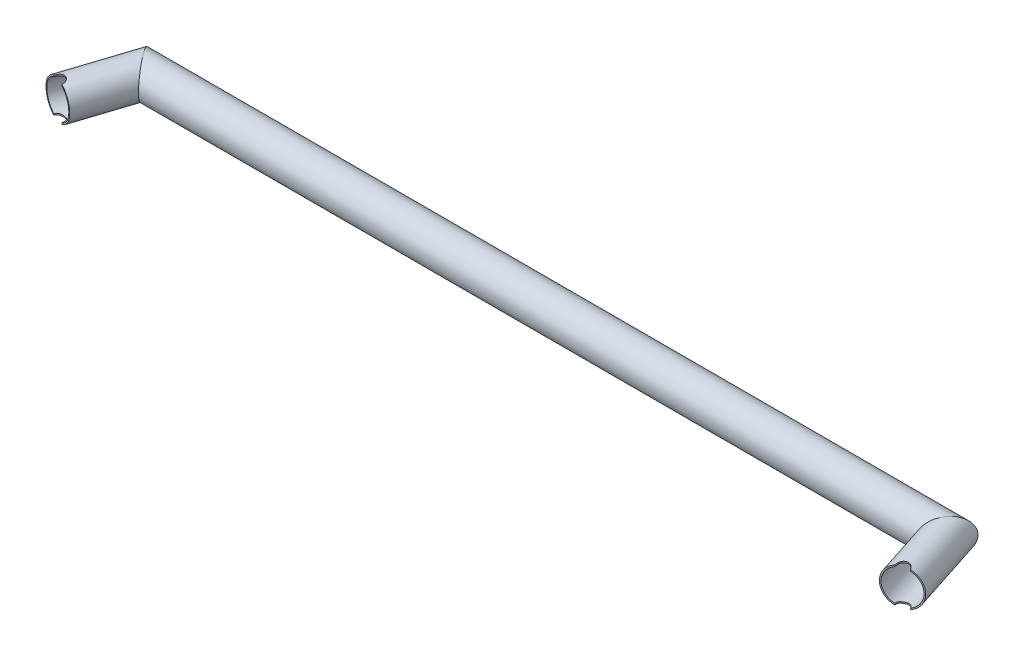
ISO-10303-21;
HEADER;
FILE_DESCRIPTION(('STEP AP214'),'2;1');
FILE_NAME('part.step','',(''),(''),'','','');
FILE_SCHEMA(('AUTOMOTIVE_DESIGN { 1 0 10303 214 1 1 1 1 }'));
ENDSEC;
DATA;
#1=APPLICATION_CONTEXT('core data for automotive mechanical design processes');
#2=APPLICATION_PROTOCOL_DEFINITION('international standard','automotive_design',2000,#1);
#3=PRODUCT_CONTEXT('',#1,'mechanical');
#4=PRODUCT('Part','Part','',(#3));
#5=PRODUCT_RELATED_PRODUCT_CATEGORY('part','',(#4));
#6=PRODUCT_DEFINITION_FORMATION('','',#4);
#7=PRODUCT_DEFINITION_CONTEXT('part definition',#1,'design');
#8=PRODUCT_DEFINITION('design','',#6,#7);
#9=PRODUCT_DEFINITION_SHAPE('','',#8);
#10=(LENGTH_UNIT() NAMED_UNIT(*) SI_UNIT(.MILLI.,.METRE.));
#11=(NAMED_UNIT(*) PLANE_ANGLE_UNIT() SI_UNIT($,.RADIAN.));
#12=(NAMED_UNIT(*) SI_UNIT($,.STERADIAN.) SOLID_ANGLE_UNIT());
#13=UNCERTAINTY_MEASURE_WITH_UNIT(LENGTH_MEASURE(1.E-05),#10,'distance_accuracy_value','');
#14=(GEOMETRIC_REPRESENTATION_CONTEXT(3) GLOBAL_UNCERTAINTY_ASSIGNED_CONTEXT((#13)) GLOBAL_UNIT_ASSIGNED_CONTEXT((#10,
#11,#12)) REPRESENTATION_CONTEXT('',''));
#15=CARTESIAN_POINT('',(0.,0.,0.));
#16=DIRECTION('',(0.,0.,1.));
#17=DIRECTION('',(1.,0.,0.));
#18=AXIS2_PLACEMENT_3D('',#15,#16,#17);
#19=CARTESIAN_POINT('',(-240.81,0.,36.88));
#20=DIRECTION('',(-0.309016994374952,0.,0.951056516295152));
#21=DIRECTION('',(0.951056516295152,0.,0.309016994374952));
#22=AXIS2_PLACEMENT_3D('',#19,#20,#21);
#23=PLANE('',#22);
#24=DIRECTION('',(0.,1.,0.));
#25=VECTOR('',#24,1.);
#26=CARTESIAN_POINT('',(-237.481302192967,-10.5,37.9615594803124));
#27=LINE('',#26,#25);
#28=CARTESIAN_POINT('',(-237.481302192967,-9.89949493661157,37.9615594803124));
#29=VERTEX_POINT('',#28);
#30=CARTESIAN_POINT('',(-237.481302192967,-9.10013736160055,37.9615594803124));
#31=VERTEX_POINT('',#30);
#32=EDGE_CURVE('E68',#29,#31,#27,.T.);
#33=ORIENTED_EDGE('',*,*,#32,.F.);
#34=CARTESIAN_POINT('',(-240.81,0.,36.88));
#35=DIRECTION('',(-0.309016994374952,0.,0.951056516295152));
#36=DIRECTION('',(0.951056516295152,0.,0.309016994374952));
#37=AXIS2_PLACEMENT_3D('',#34,#35,#36);
#38=CIRCLE('',#37,10.5);
#39=CARTESIAN_POINT('',(-237.481302192967,9.89949493661157,37.9615594803124));
#40=VERTEX_POINT('',#39);
#41=EDGE_CURVE('E157',#29,#40,#38,.T.);
#42=ORIENTED_EDGE('',*,*,#41,.T.);
#43=CARTESIAN_POINT('',(-237.481302192967,9.10013736160055,37.9615594803124));
#44=VERTEX_POINT('',#43);
#45=EDGE_CURVE('E239',#44,#40,#27,.T.);
#46=ORIENTED_EDGE('',*,*,#45,.F.);
#47=CARTESIAN_POINT('',(-240.81,0.,36.88));
#48=DIRECTION('',(-0.309016994374952,0.,0.951056516295152));
#49=DIRECTION('',(0.951056516295152,0.,0.309016994374952));
#50=AXIS2_PLACEMENT_3D('',#47,#48,#49);
#51=CIRCLE('',#50,9.75);
#52=EDGE_CURVE('E153',#44,#31,#51,.F.);
#53=ORIENTED_EDGE('',*,*,#52,.T.);
#54=EDGE_LOOP('',(#33,#42,#46,#53));
#55=FACE_BOUND('',#54,.T.);
#56=ADVANCED_FACE('F39',(#55),#23,.T.);
#57=CARTESIAN_POINT('',(240.81,0.,36.8799999999999));
#58=DIRECTION('',(-0.309016994374945,0.,-0.951056516295154));
#59=DIRECTION('',(-0.951056516295154,0.,0.309016994374945));
#60=AXIS2_PLACEMENT_3D('',#57,#58,#59);
#61=PLANE('',#60);
#62=CARTESIAN_POINT('',(240.81,0.,36.8799999999999));
#63=DIRECTION('',(-0.309016994374945,0.,-0.951056516295154));
#64=DIRECTION('',(-0.951056516295154,0.,0.309016994374945));
#65=AXIS2_PLACEMENT_3D('',#62,#63,#64);
#66=CIRCLE('',#65,10.5);
#67=CARTESIAN_POINT('',(237.481302192967,-9.89949493661166,37.9615594803122));
#68=VERTEX_POINT('',#67);
#69=CARTESIAN_POINT('',(237.481302192967,9.89949493661166,37.9615594803122));
#70=VERTEX_POINT('',#69);
#71=EDGE_CURVE('E128',#68,#70,#66,.T.);
#72=ORIENTED_EDGE('',*,*,#71,.F.);
#73=DIRECTION('',(0.,1.,0.));
#74=VECTOR('',#73,1.);
#75=CARTESIAN_POINT('',(237.481302192967,-10.5,37.9615594803122));
#76=LINE('',#75,#74);
#77=CARTESIAN_POINT('',(237.481302192967,-9.10013736160064,37.9615594803122));
#78=VERTEX_POINT('',#77);
#79=EDGE_CURVE('E115',#68,#78,#76,.T.);
#80=ORIENTED_EDGE('',*,*,#79,.T.);
#81=CARTESIAN_POINT('',(240.81,0.,36.8799999999999));
#82=DIRECTION('',(-0.309016994374945,0.,-0.951056516295154));
#83=DIRECTION('',(-0.951056516295154,0.,0.309016994374945));
#84=AXIS2_PLACEMENT_3D('',#81,#82,#83);
#85=CIRCLE('',#84,9.75);
#86=CARTESIAN_POINT('',(237.481302192967,9.10013736160064,37.9615594803122));
#87=VERTEX_POINT('',#86);
#88=EDGE_CURVE('E126',#87,#78,#85,.F.);
#89=ORIENTED_EDGE('',*,*,#88,.F.);
#90=EDGE_CURVE('E134',#87,#70,#76,.T.);
#91=ORIENTED_EDGE('',*,*,#90,.T.);
#92=EDGE_LOOP('',(#72,#80,#89,#91));
#93=FACE_BOUND('',#92,.T.);
#94=ADVANCED_FACE('F127',(#93),#61,.F.);
#95=CARTESIAN_POINT('',(-226.202923338746,0.,-8.0759593665988));
#96=DIRECTION('',(-0.309016994374952,0.,0.951056516295152));
#97=DIRECTION('',(0.951056516295152,0.,0.309016994374952));
#98=AXIS2_PLACEMENT_3D('',#95,#96,#97);
#99=CYLINDRICAL_SURFACE('',#98,10.5);
#100=CARTESIAN_POINT('',(-244.138697807033,-9.89949493661176,35.7984405196877));
#101=CARTESIAN_POINT('',(-244.109201773844,-9.89947970582429,35.7076203297763));
#102=CARTESIAN_POINT('',(-244.075968100117,-9.90087621466406,35.6180235243606));
#103=CARTESIAN_POINT('',(-244.002342342284,-9.90637933769418,35.4419345791928));
#104=CARTESIAN_POINT('',(-243.961952192697,-9.91048522030907,35.3554416079999));
#105=CARTESIAN_POINT('',(-243.874443481843,-9.92127787353517,35.1864184196311));
#106=CARTESIAN_POINT('',(-243.827345139319,-9.92795698790174,35.1038772559007));
#107=CARTESIAN_POINT('',(-243.726728962994,-9.94367667868409,34.9430694790435));
#108=CARTESIAN_POINT('',(-243.673210897225,-9.95271734044466,34.8648030205253));
#109=CARTESIAN_POINT('',(-243.503685586592,-9.9829791711149,34.6372932850828));
#110=CARTESIAN_POINT('',(-243.378577035287,-10.0073574143772,34.4950893907313));
#111=CARTESIAN_POINT('',(-243.107795488754,-10.0617584772249,34.2331695030338));
#112=CARTESIAN_POINT('',(-242.962109891135,-10.0917847597135,34.1134673963946));
#113=CARTESIAN_POINT('',(-242.648343267814,-10.1554065534544,33.8953305008831));
#114=CARTESIAN_POINT('',(-242.479653145938,-10.1890906519993,33.7977957918276));
#115=CARTESIAN_POINT('',(-242.128272815961,-10.2554847741582,33.6319357736357));
#116=CARTESIAN_POINT('',(-241.945580122971,-10.2881946234457,33.5636156631274));
#117=CARTESIAN_POINT('',(-241.565755077858,-10.349985885373,33.456734798584));
#118=CARTESIAN_POINT('',(-241.368370299057,-10.3789503095517,33.4189973290033));
#119=CARTESIAN_POINT('',(-240.969068577431,-10.4289363062747,33.3778653410457));
#120=CARTESIAN_POINT('',(-240.76715303886,-10.4499603047961,33.374460325155));
#121=CARTESIAN_POINT('',(-240.371924196473,-10.4810674890078,33.402076170313));
#122=CARTESIAN_POINT('',(-240.178555982993,-10.4915058154536,33.4319036345193));
#123=CARTESIAN_POINT('',(-239.799246168049,-10.5015262932802,33.5234519048833));
#124=CARTESIAN_POINT('',(-239.613302807571,-10.5011110314386,33.5851651081528));
#125=CARTESIAN_POINT('',(-239.261656688632,-10.4897113564684,33.7355174229137));
#126=CARTESIAN_POINT('',(-239.095446088705,-10.4791421505107,33.8230054337891));
#127=CARTESIAN_POINT('',(-238.7796955859,-10.4491436017114,34.0229404471008));
#128=CARTESIAN_POINT('',(-238.630156607969,-10.4297137675838,34.1353888333114));
#129=CARTESIAN_POINT('',(-238.349613855659,-10.3836484493089,34.3835925466223));
#130=CARTESIAN_POINT('',(-238.218879750987,-10.3569215489312,34.5196349813673));
#131=CARTESIAN_POINT('',(-237.981256084243,-10.2990433441501,34.8103455556596));
#132=CARTESIAN_POINT('',(-237.874373024352,-10.2678908370334,34.9650187566033));
#133=CARTESIAN_POINT('',(-237.682364755626,-10.2027203963027,35.296848827253));
#134=CARTESIAN_POINT('',(-237.598498161332,-10.168636603316,35.4747207290265));
#135=CARTESIAN_POINT('',(-237.461552064857,-10.1026588159504,35.8425228499273));
#136=CARTESIAN_POINT('',(-237.408482500791,-10.0707655313662,36.0324569395766));
#137=CARTESIAN_POINT('',(-237.353006447623,-10.0271289702318,36.3239274614811));
#138=CARTESIAN_POINT('',(-237.338520001939,-10.0131924325295,36.4229764705378));
#139=CARTESIAN_POINT('',(-237.318074667001,-9.98726461907497,36.6221905360224));
#140=CARTESIAN_POINT('',(-237.312112221979,-9.97527253405059,36.7223551095119));
#141=CARTESIAN_POINT('',(-237.308827237367,-9.95363891405562,36.9229646755387));
#142=CARTESIAN_POINT('',(-237.311495258866,-9.94399482355499,37.0234092417649));
#143=CARTESIAN_POINT('',(-237.325485882849,-9.92736924487806,37.2238767401061));
#144=CARTESIAN_POINT('',(-237.336804526677,-9.92038654100079,37.3238998440426));
#145=CARTESIAN_POINT('',(-237.366758733997,-9.90978565811347,37.5145124577984));
#146=CARTESIAN_POINT('',(-237.384710611301,-9.90593670954808,37.6051971355792));
#147=CARTESIAN_POINT('',(-237.427715738225,-9.90078628908031,37.7848154269106));
#148=CARTESIAN_POINT('',(-237.452759776557,-9.89948153000924,37.8737511528065));
#149=CARTESIAN_POINT('',(-237.481302192967,-9.89949493661157,37.9615594803124));
#150=B_SPLINE_CURVE_WITH_KNOTS('',3,(#100,#101,#102,#103,#104,#105,#106,#107,#108,#109,#110,
#111,#112,#113,#114,#115,#116,#117,#118,#119,#120,#121,#122,#123,#124,#125,#126,#127,#128,#129,
#130,#131,#132,#133,#134,#135,#136,#137,#138,#139,#140,#141,#142,#143,#144,#145,#146,#147,#148,
#149),.UNSPECIFIED.,.F.,.F.,(4,2,2,2,2,2,2,2,2,2,2,2,2,2,2,2,2,2,2,2,2,2,2,2,4),(0.,
0.286364696574011,0.572652101593118,0.858094201200715,1.14354661792755,1.71361423692558,
2.28403251951735,2.87459009723744,3.4652527187749,4.07133207620232,4.67722611278323,
5.26204389900287,5.84672230461621,6.40846706984446,6.97024298533242,7.53940808245256,
8.10872815415062,8.70480431557548,9.30107272226721,9.60395972919264,9.90672035058273,
10.2091499627614,10.5114412613721,10.7886947359792,11.0655897528501),.UNSPECIFIED.);
#151=CARTESIAN_POINT('',(-244.138697807033,-9.89949493661176,35.7984405196878));
#152=VERTEX_POINT('',#151);
#153=EDGE_CURVE('E238',#152,#29,#150,.T.);
#154=ORIENTED_EDGE('',*,*,#153,.F.);
#155=CARTESIAN_POINT('',(-244.138697807033,9.89949493661176,35.7984405196878));
#156=VERTEX_POINT('',#155);
#157=EDGE_CURVE('E158',#156,#152,#38,.T.);
#158=ORIENTED_EDGE('',*,*,#157,.F.);
#159=CARTESIAN_POINT('',(-237.481302192967,9.89949493661157,37.9615594803124));
#160=CARTESIAN_POINT('',(-237.451782216843,9.89947970582411,37.8707470699321));
#161=CARTESIAN_POINT('',(-237.426005142798,9.90087621466387,37.7787274684127));
#162=CARTESIAN_POINT('',(-237.382067147047,9.906379337694,37.5929923846075));
#163=CARTESIAN_POINT('',(-237.363904171574,9.91048522030889,37.4992773667536));
#164=CARTESIAN_POINT('',(-237.335350868393,9.92127787353499,37.3110984052322));
#165=CARTESIAN_POINT('',(-237.324937749153,9.92795698790156,37.2166374898963));
#166=CARTESIAN_POINT('',(-237.311817506018,9.94367667868391,37.0274005610051));
#167=CARTESIAN_POINT('',(-237.309110660665,9.95271734044448,36.9326245361842));
#168=CARTESIAN_POINT('',(-237.312532650698,9.98297917111473,36.6489208163449));
#169=CARTESIAN_POINT('',(-237.330162242927,10.007357414377,36.4603384877556));
#170=CARTESIAN_POINT('',(-237.395276468565,10.0617584772247,36.0892794477986));
#171=CARTESIAN_POINT('',(-237.442779459924,10.0917847597134,35.9068065635127));
#172=CARTESIAN_POINT('',(-237.568404340295,10.1554065534543,35.5459027140945));
#173=CARTESIAN_POINT('',(-237.647548052107,10.1890906519991,35.3678419110808));
#174=CARTESIAN_POINT('',(-237.834330637909,10.2554847741581,35.0271221617702));
#175=CARTESIAN_POINT('',(-237.941974577894,10.2881946234456,34.8644659606701));
#176=CARTESIAN_POINT('',(-238.186436498349,10.3499858853729,34.5547419649123));
#177=CARTESIAN_POINT('',(-238.323942610752,10.3789503095516,34.4081918486903));
#178=CARTESIAN_POINT('',(-238.622807713512,10.4289363062746,34.1402117082334));
#179=CARTESIAN_POINT('',(-238.784159397519,10.4499603047961,34.0187740167312));
#180=CARTESIAN_POINT('',(-239.120138434191,10.4810674890078,33.8088060199422));
#181=CARTESIAN_POINT('',(-239.294108748642,10.4915058154536,33.7192779612389));
#182=CARTESIAN_POINT('',(-239.654787558257,10.5015262932802,33.5703893524951));
#183=CARTESIAN_POINT('',(-239.841493007629,10.5011110314386,33.5110216176669));
#184=CARTESIAN_POINT('',(-240.214355567121,10.4897113564684,33.4259667927133));
#185=CARTESIAN_POINT('',(-240.400246929653,10.4791421505108,33.3990499409038));
#186=CARTESIAN_POINT('',(-240.773213304645,10.4491436017115,33.3752072754911));
#187=CARTESIAN_POINT('',(-240.960288382172,10.4297137675839,33.3782831250546));
#188=CARTESIAN_POINT('',(-241.333142718688,10.383648449309,33.4141852547449));
#189=CARTESIAN_POINT('',(-241.518872567941,10.3569215489313,33.4474023177118));
#190=CARTESIAN_POINT('',(-241.881989540857,10.2990433441502,33.542920425851));
#191=CARTESIAN_POINT('',(-242.059374379159,10.2678908370335,33.6052293876652));
#192=CARTESIAN_POINT('',(-242.409757153414,10.2027203963029,33.7608259253901));
#193=CARTESIAN_POINT('',(-242.582157134118,10.1686366033162,33.8554317694603));
#194=CARTESIAN_POINT('',(-242.909137515907,10.1026588159505,34.0724950399696));
#195=CARTESIAN_POINT('',(-243.063712151923,10.0707655313663,34.1949614392034));
#196=CARTESIAN_POINT('',(-243.279915295971,10.0271289702319,34.3981580388758));
#197=CARTESIAN_POINT('',(-243.349854623495,10.0131924325297,34.4697754513474));
#198=CARTESIAN_POINT('',(-243.483490336657,9.98726461907515,34.6189255494882));
#199=CARTESIAN_POINT('',(-243.547189315107,9.97527253405077,34.6964557544241));
#200=CARTESIAN_POINT('',(-243.667762267863,9.95363891405579,34.856821437065));
#201=CARTESIAN_POINT('',(-243.72464362783,9.94399482355517,34.9396510218244));
#202=CARTESIAN_POINT('',(-243.831156814355,9.92736924487825,35.1100561172498));
#203=CARTESIAN_POINT('',(-243.880791944527,9.92038654100097,35.1976294400829));
#204=CARTESIAN_POINT('',(-243.968597765019,9.90978565811366,35.3694449252602));
#205=CARTESIAN_POINT('',(-244.007377507407,9.90593670954827,35.4533622194446));
#206=CARTESIAN_POINT('',(-244.078162611567,9.90078628908049,35.623954249011));
#207=CARTESIAN_POINT('',(-244.110176667033,9.89948153000942,35.7106252790573));
#208=CARTESIAN_POINT('',(-244.138697807033,9.89949493661176,35.7984405196877));
#209=B_SPLINE_CURVE_WITH_KNOTS('',3,(#159,#160,#161,#162,#163,#164,#165,#166,#167,#168,#169,
#170,#171,#172,#173,#174,#175,#176,#177,#178,#179,#180,#181,#182,#183,#184,#185,#186,#187,#188,
#189,#190,#191,#192,#193,#194,#195,#196,#197,#198,#199,#200,#201,#202,#203,#204,#205,#206,#207,
#208),.UNSPECIFIED.,.F.,.F.,(4,2,2,2,2,2,2,2,2,2,2,2,2,2,2,2,2,2,2,2,2,2,2,2,4),(0.,
0.286364696574018,0.572652101593119,0.8580942012007,1.14354661792753,1.71361423692554,
2.2840325195173,2.8745900972374,3.46525271877485,4.07133207620226,4.67722611278316,
5.26204389900281,5.84672230461619,6.40846706984445,6.97024298533239,7.5394080824526,
8.10872815415059,8.70480431557545,9.30107272226717,9.6039597291926,9.90672035058268,
10.2091499627613,10.5114412613721,10.7886947359792,11.0655897528501),.UNSPECIFIED.);
#210=EDGE_CURVE('E144',#40,#156,#209,.T.);
#211=ORIENTED_EDGE('',*,*,#210,.F.);
#212=ORIENTED_EDGE('',*,*,#41,.F.);
#213=EDGE_LOOP('',(#154,#158,#211,#212));
#214=FACE_BOUND('',#213,.T.);
#215=CARTESIAN_POINT('',(-228.82696160293,0.,0.));
#216=DIRECTION('',(-0.809016994374949,0.,0.587785252292471));
#217=DIRECTION('',(-0.587785252292471,0.,-0.809016994374949));
#218=AXIS2_PLACEMENT_3D('',#215,#216,#217);
#219=ELLIPSE('',#218,12.9787137637478,10.5);
#220=CARTESIAN_POINT('',(-236.455658146987,0.,-10.5));
#221=VERTEX_POINT('',#220);
#222=EDGE_CURVE('E164',#221,#221,#219,.F.);
#223=ORIENTED_EDGE('',*,*,#222,.F.);
#224=EDGE_LOOP('',(#223));
#225=FACE_BOUND('',#224,.T.);
#226=ADVANCED_FACE('F41',(#214,#225),#99,.T.);
#227=CARTESIAN_POINT('',(237.318527801392,0.,0.));
#228=DIRECTION('',(-1.,0.,0.));
#229=DIRECTION('',(0.,0.,1.));
#230=AXIS2_PLACEMENT_3D('',#227,#228,#229);
#231=CYLINDRICAL_SURFACE('',#230,10.5);
#232=CARTESIAN_POINT('',(228.82696160293,0.,0.));
#233=DIRECTION('',(-0.809016994374947,0.,-0.587785252292474));
#234=DIRECTION('',(0.587785252292474,0.,-0.809016994374947));
#235=AXIS2_PLACEMENT_3D('',#232,#233,#234);
#236=ELLIPSE('',#235,12.9787137637478,10.5);
#237=CARTESIAN_POINT('',(236.455658146987,0.,-10.5));
#238=VERTEX_POINT('',#237);
#239=EDGE_CURVE('E165',#238,#238,#236,.F.);
#240=ORIENTED_EDGE('',*,*,#239,.F.);
#241=EDGE_LOOP('',(#240));
#242=FACE_BOUND('',#241,.T.);
#243=ORIENTED_EDGE('',*,*,#222,.T.);
#244=EDGE_LOOP('',(#243));
#245=FACE_BOUND('',#244,.T.);
#246=ADVANCED_FACE('F208',(#242,#245),#231,.T.);
#247=CARTESIAN_POINT('',(240.81,0.,36.8799999999999));
#248=DIRECTION('',(-0.309016994374945,0.,-0.951056516295154));
#249=DIRECTION('',(-0.951056516295154,0.,0.309016994374945));
#250=AXIS2_PLACEMENT_3D('',#247,#248,#249);
#251=CYLINDRICAL_SURFACE('',#250,10.5);
#252=CARTESIAN_POINT('',(237.481302192967,-9.89949493661166,37.9615594803122));
#253=CARTESIAN_POINT('',(237.451782216843,-9.8994797058242,37.8707470699319));
#254=CARTESIAN_POINT('',(237.426005142798,-9.90087621466397,37.7787274684125));
#255=CARTESIAN_POINT('',(237.382067147047,-9.9063793376941,37.5929923846073));
#256=CARTESIAN_POINT('',(237.363904171574,-9.91048522030899,37.4992773667534));
#257=CARTESIAN_POINT('',(237.335350868392,-9.9212778735351,37.311098405232));
#258=CARTESIAN_POINT('',(237.324937749153,-9.92795698790166,37.2166374898961));
#259=CARTESIAN_POINT('',(237.311817506018,-9.94367667868402,37.0274005610049));
#260=CARTESIAN_POINT('',(237.309110660665,-9.95271734044459,36.932624536184));
#261=CARTESIAN_POINT('',(237.312532650698,-9.98297917111484,36.6489208163447));
#262=CARTESIAN_POINT('',(237.330162242927,-10.0073574143771,36.4603384877553));
#263=CARTESIAN_POINT('',(237.395276468565,-10.0617584772249,36.0892794477984));
#264=CARTESIAN_POINT('',(237.442779459924,-10.0917847597135,35.9068065635125));
#265=CARTESIAN_POINT('',(237.568404340295,-10.1554065534544,35.5459027140943));
#266=CARTESIAN_POINT('',(237.647548052107,-10.1890906519992,35.3678419110805));
#267=CARTESIAN_POINT('',(237.834330637909,-10.2554847741582,35.0271221617699));
#268=CARTESIAN_POINT('',(237.941974577894,-10.2881946234457,34.8644659606699));
#269=CARTESIAN_POINT('',(238.186436498349,-10.349985885373,34.5547419649121));
#270=CARTESIAN_POINT('',(238.323942610752,-10.3789503095517,34.4081918486902));
#271=CARTESIAN_POINT('',(238.622807713512,-10.4289363062747,34.1402117082333));
#272=CARTESIAN_POINT('',(238.784159397519,-10.4499603047961,34.0187740167311));
#273=CARTESIAN_POINT('',(239.120138434191,-10.4810674890078,33.8088060199421));
#274=CARTESIAN_POINT('',(239.294108748642,-10.4915058154536,33.7192779612388));
#275=CARTESIAN_POINT('',(239.654787558258,-10.5015262932802,33.570389352495));
#276=CARTESIAN_POINT('',(239.841493007629,-10.5011110314386,33.5110216176668));
#277=CARTESIAN_POINT('',(240.214355567122,-10.4897113564684,33.4259667927133));
#278=CARTESIAN_POINT('',(240.400246929653,-10.4791421505107,33.3990499409037));
#279=CARTESIAN_POINT('',(240.773213304646,-10.4491436017114,33.3752072754911));
#280=CARTESIAN_POINT('',(240.960288382172,-10.4297137675838,33.3782831250547));
#281=CARTESIAN_POINT('',(241.333142718688,-10.3836484493089,33.414185254745));
#282=CARTESIAN_POINT('',(241.518872567941,-10.3569215489312,33.4474023177118));
#283=CARTESIAN_POINT('',(241.881989540857,-10.2990433441501,33.5429204258511));
#284=CARTESIAN_POINT('',(242.059374379159,-10.2678908370335,33.6052293876653));
#285=CARTESIAN_POINT('',(242.409757153414,-10.2027203963028,33.7608259253902));
#286=CARTESIAN_POINT('',(242.582157134118,-10.1686366033161,33.8554317694604));
#287=CARTESIAN_POINT('',(242.909137515907,-10.1026588159504,34.0724950399697));
#288=CARTESIAN_POINT('',(243.063712151924,-10.0707655313662,34.1949614392036));
#289=CARTESIAN_POINT('',(243.279915295971,-10.0271289702318,34.3981580388759));
#290=CARTESIAN_POINT('',(243.349854623495,-10.0131924325296,34.4697754513476));
#291=CARTESIAN_POINT('',(243.483490336657,-9.98726461907504,34.6189255494884));
#292=CARTESIAN_POINT('',(243.547189315107,-9.97527253405066,34.6964557544243));
#293=CARTESIAN_POINT('',(243.667762267864,-9.95363891405569,34.8568214370652));
#294=CARTESIAN_POINT('',(243.724643627831,-9.94399482355506,34.9396510218246));
#295=CARTESIAN_POINT('',(243.831156814355,-9.92736924487814,35.11005611725));
#296=CARTESIAN_POINT('',(243.880791944527,-9.92038654100087,35.1976294400831));
#297=CARTESIAN_POINT('',(243.968597765019,-9.90978565811356,35.3694449252604));
#298=CARTESIAN_POINT('',(244.007377507408,-9.90593670954817,35.4533622194447));
#299=CARTESIAN_POINT('',(244.078162611567,-9.9007862890804,35.623954249011));
#300=CARTESIAN_POINT('',(244.110176667033,-9.89948153000934,35.7106252790572));
#301=CARTESIAN_POINT('',(244.138697807033,-9.89949493661166,35.7984405196876));
#302=B_SPLINE_CURVE_WITH_KNOTS('',3,(#252,#253,#254,#255,#256,#257,#258,#259,#260,#261,#262,
#263,#264,#265,#266,#267,#268,#269,#270,#271,#272,#273,#274,#275,#276,#277,#278,#279,#280,#281,
#282,#283,#284,#285,#286,#287,#288,#289,#290,#291,#292,#293,#294,#295,#296,#297,#298,#299,#300,
#301),.UNSPECIFIED.,.F.,.F.,(4,2,2,2,2,2,2,2,2,2,2,2,2,2,2,2,2,2,2,2,2,2,2,2,4),(0.,
0.286364696574009,0.572652101593111,0.858094201200712,1.14354661792754,1.71361423692557,
2.28403251951732,2.87459009723745,3.4652527187749,4.07133207620227,4.67722611278316,
5.26204389900279,5.84672230461622,6.40846706984447,6.97024298533242,7.53940808245261,
8.10872815415061,8.70480431557546,9.30107272226719,9.60395972919262,9.90672035058272,
10.2091499627614,10.5114412613721,10.788694735979,11.0655897528497),.UNSPECIFIED.);
#303=CARTESIAN_POINT('',(244.138697807033,-9.89949493661166,35.7984405196876));
#304=VERTEX_POINT('',#303);
#305=EDGE_CURVE('E132',#68,#304,#302,.T.);
#306=ORIENTED_EDGE('',*,*,#305,.F.);
#307=ORIENTED_EDGE('',*,*,#71,.T.);
#308=CARTESIAN_POINT('',(244.138697807033,9.89949493661166,35.7984405196876));
#309=CARTESIAN_POINT('',(244.109201773844,9.8994797058242,35.7076203297762));
#310=CARTESIAN_POINT('',(244.075968100117,9.90087621466397,35.6180235243604));
#311=CARTESIAN_POINT('',(244.002342342284,9.9063793376941,35.4419345791927));
#312=CARTESIAN_POINT('',(243.961952192697,9.91048522030899,35.3554416079998));
#313=CARTESIAN_POINT('',(243.874443481843,9.92127787353509,35.186418419631));
#314=CARTESIAN_POINT('',(243.827345139319,9.92795698790166,35.1038772559006));
#315=CARTESIAN_POINT('',(243.726728962994,9.94367667868402,34.9430694790434));
#316=CARTESIAN_POINT('',(243.673210897225,9.95271734044458,34.8648030205252));
#317=CARTESIAN_POINT('',(243.503685586592,9.98297917111483,34.6372932850827));
#318=CARTESIAN_POINT('',(243.378577035287,10.0073574143771,34.4950893907312));
#319=CARTESIAN_POINT('',(243.107795488754,10.0617584772249,34.2331695030337));
#320=CARTESIAN_POINT('',(242.962109891134,10.0917847597135,34.1134673963946));
#321=CARTESIAN_POINT('',(242.648343267814,10.1554065534543,33.8953305008831));
#322=CARTESIAN_POINT('',(242.479653145938,10.1890906519992,33.7977957918276));
#323=CARTESIAN_POINT('',(242.128272815961,10.2554847741582,33.6319357736356));
#324=CARTESIAN_POINT('',(241.945580122971,10.2881946234457,33.5636156631273));
#325=CARTESIAN_POINT('',(241.565755077858,10.349985885373,33.456734798584));
#326=CARTESIAN_POINT('',(241.368370299056,10.3789503095517,33.4189973290033));
#327=CARTESIAN_POINT('',(240.96906857743,10.4289363062747,33.3778653410457));
#328=CARTESIAN_POINT('',(240.76715303886,10.4499603047961,33.374460325155));
#329=CARTESIAN_POINT('',(240.371924196473,10.4810674890078,33.402076170313));
#330=CARTESIAN_POINT('',(240.178555982993,10.4915058154536,33.4319036345193));
#331=CARTESIAN_POINT('',(239.799246168049,10.5015262932802,33.5234519048833));
#332=CARTESIAN_POINT('',(239.613302807571,10.5011110314386,33.5851651081529));
#333=CARTESIAN_POINT('',(239.261656688632,10.4897113564684,33.7355174229137));
#334=CARTESIAN_POINT('',(239.095446088705,10.4791421505107,33.8230054337891));
#335=CARTESIAN_POINT('',(238.7796955859,10.4491436017114,34.0229404471008));
#336=CARTESIAN_POINT('',(238.630156607969,10.4297137675839,34.1353888333114));
#337=CARTESIAN_POINT('',(238.349613855659,10.3836484493089,34.3835925466224));
#338=CARTESIAN_POINT('',(238.218879750987,10.3569215489312,34.5196349813674));
#339=CARTESIAN_POINT('',(237.981256084243,10.2990433441501,34.8103455556597));
#340=CARTESIAN_POINT('',(237.874373024352,10.2678908370335,34.9650187566034));
#341=CARTESIAN_POINT('',(237.682364755626,10.2027203963028,35.2968488272531));
#342=CARTESIAN_POINT('',(237.598498161332,10.1686366033161,35.4747207290266));
#343=CARTESIAN_POINT('',(237.461552064857,10.1026588159504,35.8425228499274));
#344=CARTESIAN_POINT('',(237.408482500791,10.0707655313662,36.0324569395767));
#345=CARTESIAN_POINT('',(237.353006447623,10.0271289702318,36.3239274614812));
#346=CARTESIAN_POINT('',(237.338520001939,10.0131924325296,36.4229764705379));
#347=CARTESIAN_POINT('',(237.318074667001,9.98726461907504,36.6221905360225));
#348=CARTESIAN_POINT('',(237.312112221979,9.97527253405066,36.722355109512));
#349=CARTESIAN_POINT('',(237.308827237367,9.95363891405569,36.9229646755388));
#350=CARTESIAN_POINT('',(237.311495258866,9.94399482355506,37.0234092417651));
#351=CARTESIAN_POINT('',(237.325485882849,9.92736924487814,37.2238767401062));
#352=CARTESIAN_POINT('',(237.336804526677,9.92038654100087,37.3238998440427));
#353=CARTESIAN_POINT('',(237.366758733997,9.90978565811356,37.5145124577985));
#354=CARTESIAN_POINT('',(237.384710611301,9.90593670954817,37.6051971355792));
#355=CARTESIAN_POINT('',(237.427715738225,9.9007862890804,37.7848154269104));
#356=CARTESIAN_POINT('',(237.452759776557,9.89948153000933,37.8737511528063));
#357=CARTESIAN_POINT('',(237.481302192967,9.89949493661166,37.9615594803122));
#358=B_SPLINE_CURVE_WITH_KNOTS('',3,(#308,#309,#310,#311,#312,#313,#314,#315,#316,#317,#318,
#319,#320,#321,#322,#323,#324,#325,#326,#327,#328,#329,#330,#331,#332,#333,#334,#335,#336,#337,
#338,#339,#340,#341,#342,#343,#344,#345,#346,#347,#348,#349,#350,#351,#352,#353,#354,#355,#356,
#357),.UNSPECIFIED.,.F.,.F.,(4,2,2,2,2,2,2,2,2,2,2,2,2,2,2,2,2,2,2,2,2,2,2,2,4),(0.,
0.286364696574001,0.572652101593109,0.858094201200688,1.14354661792753,1.71361423692551,
2.28403251951727,2.87459009723742,3.4652527187749,4.07133207620226,4.67722611278317,
5.26204389900279,5.84672230461619,6.40846706984443,6.97024298533237,7.53940808245255,
8.10872815415059,8.70480431557544,9.30107272226718,9.6039597291926,9.90672035058269,
10.2091499627613,10.5114412613721,10.788694735979,11.0655897528497),.UNSPECIFIED.);
#359=CARTESIAN_POINT('',(244.138697807033,9.89949493661166,35.7984405196876));
#360=VERTEX_POINT('',#359);
#361=EDGE_CURVE('E197',#360,#70,#358,.T.);
#362=ORIENTED_EDGE('',*,*,#361,.F.);
#363=EDGE_CURVE('E156',#360,#304,#66,.T.);
#364=ORIENTED_EDGE('',*,*,#363,.T.);
#365=EDGE_LOOP('',(#306,#307,#362,#364));
#366=FACE_BOUND('',#365,.T.);
#367=ORIENTED_EDGE('',*,*,#239,.T.);
#368=EDGE_LOOP('',(#367));
#369=FACE_BOUND('',#368,.T.);
#370=ADVANCED_FACE('F201',(#366,#369),#251,.T.);
#371=DIRECTION('',(0.,1.,0.));
#372=VECTOR('',#371,1.);
#373=CARTESIAN_POINT('',(-244.138697807033,-10.5,35.7984405196877));
#374=LINE('',#373,#372);
#375=CARTESIAN_POINT('',(-244.138697807033,9.10013736160075,35.7984405196877));
#376=VERTEX_POINT('',#375);
#377=EDGE_CURVE('E58',#156,#376,#374,.F.);
#378=ORIENTED_EDGE('',*,*,#377,.F.);
#379=ORIENTED_EDGE('',*,*,#157,.T.);
#380=CARTESIAN_POINT('',(-244.138697807033,-9.10013736160075,35.7984405196877));
#381=VERTEX_POINT('',#380);
#382=EDGE_CURVE('E242',#381,#152,#374,.F.);
#383=ORIENTED_EDGE('',*,*,#382,.F.);
#384=EDGE_CURVE('E143',#381,#376,#51,.F.);
#385=ORIENTED_EDGE('',*,*,#384,.T.);
#386=EDGE_LOOP('',(#378,#379,#383,#385));
#387=FACE_BOUND('',#386,.T.);
#388=ADVANCED_FACE('F210',(#387),#23,.T.);
#389=ORIENTED_EDGE('',*,*,#363,.F.);
#390=DIRECTION('',(0.,1.,0.));
#391=VECTOR('',#390,1.);
#392=CARTESIAN_POINT('',(244.138697807033,-10.5,35.7984405196876));
#393=LINE('',#392,#391);
#394=CARTESIAN_POINT('',(244.138697807033,9.10013736160064,35.7984405196876));
#395=VERTEX_POINT('',#394);
#396=EDGE_CURVE('E191',#360,#395,#393,.F.);
#397=ORIENTED_EDGE('',*,*,#396,.T.);
#398=CARTESIAN_POINT('',(244.138697807033,-9.10013736160064,35.7984405196876));
#399=VERTEX_POINT('',#398);
#400=EDGE_CURVE('E140',#399,#395,#85,.F.);
#401=ORIENTED_EDGE('',*,*,#400,.F.);
#402=EDGE_CURVE('E113',#399,#304,#393,.F.);
#403=ORIENTED_EDGE('',*,*,#402,.T.);
#404=EDGE_LOOP('',(#389,#397,#401,#403));
#405=FACE_BOUND('',#404,.T.);
#406=ADVANCED_FACE('F227',(#405),#61,.F.);
#407=CARTESIAN_POINT('',(-226.388147379085,0.,-7.50589838695816));
#408=DIRECTION('',(-0.309016994374952,0.,0.951056516295152));
#409=DIRECTION('',(0.951056516295152,0.,0.309016994374952));
#410=AXIS2_PLACEMENT_3D('',#407,#408,#409);
#411=CYLINDRICAL_SURFACE('',#410,9.75);
#412=CARTESIAN_POINT('',(-244.138697807033,9.10013736160075,35.7984405196877));
#413=CARTESIAN_POINT('',(-244.109350750536,9.10012062267439,35.7080772131868));
#414=CARTESIAN_POINT('',(-244.076302674785,9.10162487202849,35.6189261527249));
#415=CARTESIAN_POINT('',(-244.003126771497,9.10755057629127,35.4437100890646));
#416=CARTESIAN_POINT('',(-243.963001135303,9.11197112941648,35.3576441405547));
#417=CARTESIAN_POINT('',(-243.876117800536,9.12358557304411,35.1894817971196));
#418=CARTESIAN_POINT('',(-243.829382477634,9.13077024189955,35.1073732138432));
#419=CARTESIAN_POINT('',(-243.729581193087,9.1476734858632,34.9473993276946));
#420=CARTESIAN_POINT('',(-243.676514947365,9.15739217469966,34.8695342154615));
#421=CARTESIAN_POINT('',(-243.508502792845,9.1899068497749,34.6431957999274));
#422=CARTESIAN_POINT('',(-243.384598370982,9.21608227527616,34.5017000582276));
#423=CARTESIAN_POINT('',(-243.116550612893,9.27446413021848,34.2408917735744));
#424=CARTESIAN_POINT('',(-242.972392387618,9.30667500232398,34.1215957014561));
#425=CARTESIAN_POINT('',(-242.661079389068,9.37512709855967,33.9032407734515));
#426=CARTESIAN_POINT('',(-242.493223161527,9.4114795356173,33.8052146704039));
#427=CARTESIAN_POINT('',(-242.143429779412,9.48318664462927,33.6381560827597));
#428=CARTESIAN_POINT('',(-241.961490000188,9.51854112891895,33.5691290179833));
#429=CARTESIAN_POINT('',(-241.582080906187,9.5855849045106,33.4603502421307));
#430=CARTESIAN_POINT('',(-241.384305748844,9.61712759559796,33.421566689743));
#431=CARTESIAN_POINT('',(-240.983876670638,9.67165897974424,33.3785322268931));
#432=CARTESIAN_POINT('',(-240.781224462917,9.69465063111467,33.3742693630562));
#433=CARTESIAN_POINT('',(-240.385309658718,9.728698179701,33.4004293686744));
#434=CARTESIAN_POINT('',(-240.191994675732,9.74019316546339,33.4294769171488));
#435=CARTESIAN_POINT('',(-239.812600341393,9.75152129400893,33.519468336664));
#436=CARTESIAN_POINT('',(-239.626518979861,9.75135770015657,33.5804032773328));
#437=CARTESIAN_POINT('',(-239.275614896642,9.73967326201036,33.7287611377415));
#438=CARTESIAN_POINT('',(-239.110210587811,9.72866834372294,33.8148559920453));
#439=CARTESIAN_POINT('',(-238.795785943441,9.6972031199441,34.0116645704511));
#440=CARTESIAN_POINT('',(-238.646766535154,9.67674227966513,34.1223796867887));
#441=CARTESIAN_POINT('',(-238.366779073587,9.62805263627284,34.3668912264846));
#442=CARTESIAN_POINT('',(-238.236094945599,9.59971844553287,34.5009908828491));
#443=CARTESIAN_POINT('',(-237.998138242765,9.53818134798905,34.7875981698223));
#444=CARTESIAN_POINT('',(-237.890872852626,9.50497695224849,34.9401114273731));
#445=CARTESIAN_POINT('',(-237.69687862613,9.43504258461896,35.2685395194354));
#446=CARTESIAN_POINT('',(-237.611569999286,9.39821905279302,35.4452729755643));
#447=CARTESIAN_POINT('',(-237.471489055341,9.32663752165608,35.8110491212431));
#448=CARTESIAN_POINT('',(-237.416727766154,9.29188027233548,36.0000962286822));
#449=CARTESIAN_POINT('',(-237.35845905271,9.24399721906833,36.2909825548173));
#450=CARTESIAN_POINT('',(-237.342984771518,9.22861386166475,36.3901899460269));
#451=CARTESIAN_POINT('',(-237.32060378049,9.19990768307397,36.5898486580378));
#452=CARTESIAN_POINT('',(-237.313693448707,9.18658399288075,36.6902994348073));
#453=CARTESIAN_POINT('',(-237.308572472961,9.1624562358886,36.8916057183548));
#454=CARTESIAN_POINT('',(-237.310351940582,9.15164931983843,36.9924606346717));
#455=CARTESIAN_POINT('',(-237.322642615298,9.13291413283267,37.1938666180003));
#456=CARTESIAN_POINT('',(-237.333149857703,9.12498455716262,37.2944178021745));
#457=CARTESIAN_POINT('',(-237.362288872076,9.11254043655967,37.4905053671861));
#458=CARTESIAN_POINT('',(-237.380585983788,9.10790419707125,37.5860838068118));
#459=CARTESIAN_POINT('',(-237.425067222503,9.10169500959945,37.7753773150821));
#460=CARTESIAN_POINT('',(-237.451242721456,9.10011872449124,37.8690943032202));
#461=CARTESIAN_POINT('',(-237.481302192967,9.10013736160055,37.9615594803124));
#462=B_SPLINE_CURVE_WITH_KNOTS('',3,(#412,#413,#414,#415,#416,#417,#418,#419,#420,#421,#422,
#423,#424,#425,#426,#427,#428,#429,#430,#431,#432,#433,#434,#435,#436,#437,#438,#439,#440,#441,
#442,#443,#444,#445,#446,#447,#448,#449,#450,#451,#452,#453,#454,#455,#456,#457,#458,#459,#460,
#461),.UNSPECIFIED.,.F.,.F.,(4,2,2,2,2,2,2,2,2,2,2,2,2,2,2,2,2,2,2,2,2,2,2,2,4),(0.,
0.284921376033762,0.569754689557235,0.853645868649515,1.13754979113297,1.70442308587671,
2.27171530447767,2.86231354842997,3.45302212410579,4.06194207032735,4.6706511586544,
5.25510559953958,5.83939644585006,6.39716204744568,6.95495919780169,7.52061563880648,
8.08644537620983,8.68280260634755,9.27937498868603,9.5837883166698,9.88807285525723,
10.1920112189366,10.4958115906715,10.78770187264,11.0792736456931),.UNSPECIFIED.);
#463=EDGE_CURVE('E11',#376,#44,#462,.T.);
#464=ORIENTED_EDGE('',*,*,#463,.F.);
#465=ORIENTED_EDGE('',*,*,#384,.F.);
#466=CARTESIAN_POINT('',(-237.481302192967,-9.10013736160055,37.9615594803124));
#467=CARTESIAN_POINT('',(-237.451930241498,-9.10012062267419,37.8712042626779));
#468=CARTESIAN_POINT('',(-237.426265017847,-9.10162487202829,37.7796543681546));
#469=CARTESIAN_POINT('',(-237.382476149001,-9.10755057629107,37.5948898781904));
#470=CARTESIAN_POINT('',(-237.364350175333,-9.11197112941628,37.5016758060151));
#471=CARTESIAN_POINT('',(-237.335796924226,-9.12358557304392,37.3145608695159));
#472=CARTESIAN_POINT('',(-237.325344380355,-9.13077024189936,37.2206632966984));
#473=CARTESIAN_POINT('',(-237.312055024583,-9.14767348586301,37.0325799809317));
#474=CARTESIAN_POINT('',(-237.309218554561,-9.15739217469947,36.9383942252364));
#475=CARTESIAN_POINT('',(-237.312104860152,-9.18990684977472,36.6565275339563));
#476=CARTESIAN_POINT('',(-237.329176532883,-9.21608227527598,36.4692258824248));
#477=CARTESIAN_POINT('',(-237.392732461086,-9.2744641302183,36.100673028752));
#478=CARTESIAN_POINT('',(-237.439238443366,-9.30667500232381,35.9194264002324));
#479=CARTESIAN_POINT('',(-237.562750143316,-9.37512709855952,35.5597883632768));
#480=CARTESIAN_POINT('',(-237.640930386297,-9.41147953561715,35.3818201649649));
#481=CARTESIAN_POINT('',(-237.825724602862,-9.48318664462913,35.0410635371475));
#482=CARTESIAN_POINT('',(-237.932343885522,-9.51854112891882,34.8782779496388));
#483=CARTESIAN_POINT('',(-238.175353730181,-9.58558490451049,34.5672630013068));
#484=CARTESIAN_POINT('',(-238.312560793412,-9.61712759559787,34.4196371275669));
#485=CARTESIAN_POINT('',(-238.611219700119,-9.67165897974417,34.1494552090189));
#486=CARTESIAN_POINT('',(-238.772663131617,-9.6946506311146,34.0268905006875));
#487=CARTESIAN_POINT('',(-239.10834140204,-9.72869817970096,33.8153415067332));
#488=CARTESIAN_POINT('',(-239.281810229152,-9.74019316546337,33.7252137710477));
#489=CARTESIAN_POINT('',(-239.641642322426,-9.75152129400893,33.5750159642555));
#490=CARTESIAN_POINT('',(-239.828001965716,-9.75135770015658,33.5149374867729));
#491=CARTESIAN_POINT('',(-240.199091894846,-9.73967326201039,33.4287052720071));
#492=CARTESIAN_POINT('',(-240.38351207729,-9.72866834372297,33.4011352588709));
#493=CARTESIAN_POINT('',(-240.753568137948,-9.69720311994416,33.3755425745219));
#494=CARTESIAN_POINT('',(-240.939204084333,-9.6767422796652,33.3775215746765));
#495=CARTESIAN_POINT('',(-241.309438976001,-9.62805263627292,33.4107630648753));
#496=CARTESIAN_POINT('',(-241.493986456787,-9.59971844553296,33.4424377626741));
#497=CARTESIAN_POINT('',(-241.854961009788,-9.53818134798916,33.5344404879371));
#498=CARTESIAN_POINT('',(-242.031385576886,-9.50497695224862,33.5947772907581));
#499=CARTESIAN_POINT('',(-242.381375391885,-9.43504258461911,33.7464542533023));
#500=CARTESIAN_POINT('',(-242.554272839867,-9.39821905279317,33.839291470033));
#501=CARTESIAN_POINT('',(-242.882598528177,-9.32663752165625,34.0528730750461));
#502=CARTESIAN_POINT('',(-243.038020443505,-9.29188027233565,34.1736275195211));
#503=CARTESIAN_POINT('',(-243.256139515517,-9.24399721906851,34.3747100103633));
#504=CARTESIAN_POINT('',(-243.326971113448,-9.22861386166493,34.445874921545));
#505=CARTESIAN_POINT('',(-243.462434161952,-9.19990768307416,34.594246996179));
#506=CARTESIAN_POINT('',(-243.527068222968,-9.18658399288094,34.671451590573));
#507=CARTESIAN_POINT('',(-243.649536044038,-9.16245623588879,34.8313017610165));
#508=CARTESIAN_POINT('',(-243.707377456923,-9.15164931983862,34.9139410471079));
#509=CARTESIAN_POINT('',(-243.81581755893,-9.13291413283287,35.0841061877282));
#510=CARTESIAN_POINT('',(-243.866419524418,-9.12498455716282,35.1716298066577));
#511=CARTESIAN_POINT('',(-243.958102945463,-9.11254043655986,35.3473954620524));
#512=CARTESIAN_POINT('',(-243.999479868389,-9.10790419707145,35.4354748164295));
#513=CARTESIAN_POINT('',(-244.074757722854,-9.10169500959965,35.6147618976653));
#514=CARTESIAN_POINT('',(-244.108666762882,-9.10011872449143,35.7059661059864));
#515=CARTESIAN_POINT('',(-244.138697807033,-9.10013736160075,35.7984405196877));
#516=B_SPLINE_CURVE_WITH_KNOTS('',3,(#466,#467,#468,#469,#470,#471,#472,#473,#474,#475,#476,
#477,#478,#479,#480,#481,#482,#483,#484,#485,#486,#487,#488,#489,#490,#491,#492,#493,#494,#495,
#496,#497,#498,#499,#500,#501,#502,#503,#504,#505,#506,#507,#508,#509,#510,#511,#512,#513,#514,
#515),.UNSPECIFIED.,.F.,.F.,(4,2,2,2,2,2,2,2,2,2,2,2,2,2,2,2,2,2,2,2,2,2,2,2,4),(0.,
0.284921376033759,0.569754689557221,0.853645868649502,1.13754979113295,1.70442308587668,
2.27171530447764,2.86231354842994,3.45302212410575,4.06194207032735,4.67065115865435,
5.2551055995396,5.83939644585006,6.39716204744572,6.95495919780169,7.52061563880649,
8.0864453762098,8.6828026063475,9.27937498868601,9.58378831666976,9.88807285525718,
10.1920112189365,10.4958115906715,10.78770187264,11.0792736456931),.UNSPECIFIED.);
#517=EDGE_CURVE('E53',#31,#381,#516,.T.);
#518=ORIENTED_EDGE('',*,*,#517,.F.);
#519=ORIENTED_EDGE('',*,*,#52,.F.);
#520=EDGE_LOOP('',(#464,#465,#518,#519));
#521=FACE_BOUND('',#520,.T.);
#522=CARTESIAN_POINT('',(-228.82696160293,0.,0.));
#523=DIRECTION('',(-0.809016994374949,0.,0.587785252292471));
#524=DIRECTION('',(-0.587785252292471,0.,-0.809016994374949));
#525=AXIS2_PLACEMENT_3D('',#522,#523,#524);
#526=ELLIPSE('',#525,12.0516627806229,9.75);
#527=CARTESIAN_POINT('',(-235.910751250983,0.,-9.75));
#528=VERTEX_POINT('',#527);
#529=EDGE_CURVE('E138',#528,#528,#526,.T.);
#530=ORIENTED_EDGE('',*,*,#529,.F.);
#531=EDGE_LOOP('',(#530));
#532=FACE_BOUND('',#531,.T.);
#533=ADVANCED_FACE('F235',(#521,#532),#411,.F.);
#534=CARTESIAN_POINT('',(236.719130215788,0.,0.));
#535=DIRECTION('',(-1.,0.,0.));
#536=DIRECTION('',(0.,0.,1.));
#537=AXIS2_PLACEMENT_3D('',#534,#535,#536);
#538=CYLINDRICAL_SURFACE('',#537,9.75);
#539=CARTESIAN_POINT('',(228.82696160293,0.,0.));
#540=DIRECTION('',(-0.809016994374947,0.,-0.587785252292474));
#541=DIRECTION('',(0.587785252292474,0.,-0.809016994374947));
#542=AXIS2_PLACEMENT_3D('',#539,#540,#541);
#543=ELLIPSE('',#542,12.051662780623,9.75);
#544=CARTESIAN_POINT('',(235.910751250983,0.,-9.74999999999999));
#545=VERTEX_POINT('',#544);
#546=EDGE_CURVE('E122',#545,#545,#543,.T.);
#547=ORIENTED_EDGE('',*,*,#546,.F.);
#548=EDGE_LOOP('',(#547));
#549=FACE_BOUND('',#548,.T.);
#550=ORIENTED_EDGE('',*,*,#529,.T.);
#551=EDGE_LOOP('',(#550));
#552=FACE_BOUND('',#551,.T.);
#553=ADVANCED_FACE('F263',(#549,#552),#538,.F.);
#554=CARTESIAN_POINT('',(240.81,0.,36.8799999999999));
#555=DIRECTION('',(-0.309016994374945,0.,-0.951056516295154));
#556=DIRECTION('',(-0.951056516295154,0.,0.309016994374945));
#557=AXIS2_PLACEMENT_3D('',#554,#555,#556);
#558=CYLINDRICAL_SURFACE('',#557,9.75);
#559=CARTESIAN_POINT('',(237.481302192967,9.10013736160064,37.9615594803122));
#560=CARTESIAN_POINT('',(237.451930241498,9.10012062267429,37.8712042626777));
#561=CARTESIAN_POINT('',(237.426265017847,9.10162487202839,37.7796543681543));
#562=CARTESIAN_POINT('',(237.382476149001,9.10755057629118,37.5948898781902));
#563=CARTESIAN_POINT('',(237.364350175333,9.11197112941639,37.5016758060149));
#564=CARTESIAN_POINT('',(237.335796924226,9.12358557304403,37.3145608695157));
#565=CARTESIAN_POINT('',(237.325344380355,9.13077024189948,37.2206632966981));
#566=CARTESIAN_POINT('',(237.312055024583,9.14767348586313,37.0325799809315));
#567=CARTESIAN_POINT('',(237.309218554561,9.15739217469958,36.9383942252361));
#568=CARTESIAN_POINT('',(237.312104860152,9.18990684977483,36.656527533956));
#569=CARTESIAN_POINT('',(237.329176532883,9.2160822752761,36.4692258824245));
#570=CARTESIAN_POINT('',(237.392732461086,9.27446413021842,36.1006730287518));
#571=CARTESIAN_POINT('',(237.439238443366,9.30667500232394,35.9194264002321));
#572=CARTESIAN_POINT('',(237.562750143316,9.37512709855963,35.5597883632766));
#573=CARTESIAN_POINT('',(237.640930386297,9.41147953561726,35.3818201649646));
#574=CARTESIAN_POINT('',(237.825724602862,9.48318664462924,35.0410635371473));
#575=CARTESIAN_POINT('',(237.932343885522,9.51854112891893,34.8782779496386));
#576=CARTESIAN_POINT('',(238.175353730181,9.58558490451058,34.5672630013066));
#577=CARTESIAN_POINT('',(238.312560793412,9.61712759559794,34.4196371275667));
#578=CARTESIAN_POINT('',(238.611219700119,9.67165897974423,34.1494552090188));
#579=CARTESIAN_POINT('',(238.772663131617,9.69465063111466,34.0268905006873));
#580=CARTESIAN_POINT('',(239.108341402041,9.728698179701,33.8153415067331));
#581=CARTESIAN_POINT('',(239.281810229152,9.74019316546339,33.7252137710476));
#582=CARTESIAN_POINT('',(239.641642322426,9.75152129400893,33.5750159642555));
#583=CARTESIAN_POINT('',(239.828001965716,9.75135770015657,33.5149374867728));
#584=CARTESIAN_POINT('',(240.199091894846,9.73967326201037,33.4287052720071));
#585=CARTESIAN_POINT('',(240.383512077291,9.72866834372294,33.4011352588708));
#586=CARTESIAN_POINT('',(240.753568137948,9.69720311994411,33.3755425745219));
#587=CARTESIAN_POINT('',(240.939204084333,9.67674227966514,33.3775215746765));
#588=CARTESIAN_POINT('',(241.309438976002,9.62805263627285,33.4107630648753));
#589=CARTESIAN_POINT('',(241.493986456787,9.59971844553288,33.4424377626742));
#590=CARTESIAN_POINT('',(241.854961009788,9.53818134798907,33.5344404879371));
#591=CARTESIAN_POINT('',(242.031385576886,9.50497695224851,33.5947772907582));
#592=CARTESIAN_POINT('',(242.381375391885,9.43504258461899,33.7464542533024));
#593=CARTESIAN_POINT('',(242.554272839868,9.39821905279305,33.8392914700332));
#594=CARTESIAN_POINT('',(242.882598528177,9.32663752165613,34.0528730750463));
#595=CARTESIAN_POINT('',(243.038020443505,9.29188027233553,34.1736275195212));
#596=CARTESIAN_POINT('',(243.256139515517,9.24399721906839,34.3747100103634));
#597=CARTESIAN_POINT('',(243.326971113449,9.22861386166481,34.4458749215451));
#598=CARTESIAN_POINT('',(243.462434161953,9.19990768307403,34.5942469961792));
#599=CARTESIAN_POINT('',(243.527068222969,9.18658399288082,34.6714515905732));
#600=CARTESIAN_POINT('',(243.649536044038,9.16245623588867,34.8313017610167));
#601=CARTESIAN_POINT('',(243.707377456924,9.1516493198385,34.9139410471081));
#602=CARTESIAN_POINT('',(243.81581755893,9.13291413283275,35.0841061877285));
#603=CARTESIAN_POINT('',(243.866419524419,9.12498455716271,35.171629806658));
#604=CARTESIAN_POINT('',(243.958102945463,9.11254043655976,35.3473954620526));
#605=CARTESIAN_POINT('',(243.999479868389,9.10790419707135,35.4354748164296));
#606=CARTESIAN_POINT('',(244.074757722854,9.10169500959955,35.6147618976653));
#607=CARTESIAN_POINT('',(244.108666762882,9.10011872449134,35.7059661059863));
#608=CARTESIAN_POINT('',(244.138697807033,9.10013736160065,35.7984405196876));
#609=B_SPLINE_CURVE_WITH_KNOTS('',3,(#559,#560,#561,#562,#563,#564,#565,#566,#567,#568,#569,
#570,#571,#572,#573,#574,#575,#576,#577,#578,#579,#580,#581,#582,#583,#584,#585,#586,#587,#588,
#589,#590,#591,#592,#593,#594,#595,#596,#597,#598,#599,#600,#601,#602,#603,#604,#605,#606,#607,
#608),.UNSPECIFIED.,.F.,.F.,(4,2,2,2,2,2,2,2,2,2,2,2,2,2,2,2,2,2,2,2,2,2,2,2,4),(0.,
0.284921376033765,0.569754689557229,0.853645868649521,1.13754979113297,1.7044230858767,
2.27171530447767,2.86231354842998,3.45302212410582,4.06194207032737,4.6706511586544,
5.25510559953963,5.83939644585008,6.3971620474457,6.95495919780171,7.52061563880648,
8.08644537620984,8.68280260634754,9.27937498868601,9.5837883166698,9.88807285525722,
10.1920112189366,10.4958115906715,10.7877018726398,11.0792736456927),.UNSPECIFIED.);
#610=EDGE_CURVE('E118',#87,#395,#609,.T.);
#611=ORIENTED_EDGE('',*,*,#610,.F.);
#612=ORIENTED_EDGE('',*,*,#88,.T.);
#613=CARTESIAN_POINT('',(244.138697807033,-9.10013736160064,35.7984405196876));
#614=CARTESIAN_POINT('',(244.109350750536,-9.10012062267429,35.7080772131866));
#615=CARTESIAN_POINT('',(244.076302674785,-9.10162487202839,35.6189261527247));
#616=CARTESIAN_POINT('',(244.003126771497,-9.10755057629118,35.4437100890644));
#617=CARTESIAN_POINT('',(243.963001135303,-9.11197112941639,35.3576441405546));
#618=CARTESIAN_POINT('',(243.876117800535,-9.12358557304403,35.1894817971194));
#619=CARTESIAN_POINT('',(243.829382477634,-9.13077024189947,35.107373213843));
#620=CARTESIAN_POINT('',(243.729581193087,-9.14767348586312,34.9473993276944));
#621=CARTESIAN_POINT('',(243.676514947365,-9.15739217469958,34.8695342154613));
#622=CARTESIAN_POINT('',(243.508502792845,-9.18990684977483,34.6431957999272));
#623=CARTESIAN_POINT('',(243.384598370982,-9.2160822752761,34.5017000582275));
#624=CARTESIAN_POINT('',(243.116550612893,-9.27446413021842,34.2408917735743));
#625=CARTESIAN_POINT('',(242.972392387618,-9.30667500232394,34.121595701456));
#626=CARTESIAN_POINT('',(242.661079389068,-9.37512709855963,33.9032407734514));
#627=CARTESIAN_POINT('',(242.493223161527,-9.41147953561726,33.8052146704038));
#628=CARTESIAN_POINT('',(242.143429779412,-9.48318664462924,33.6381560827596));
#629=CARTESIAN_POINT('',(241.961490000188,-9.51854112891893,33.5691290179832));
#630=CARTESIAN_POINT('',(241.582080906186,-9.58558490451058,33.4603502421306));
#631=CARTESIAN_POINT('',(241.384305748843,-9.61712759559794,33.421566689743));
#632=CARTESIAN_POINT('',(240.983876670637,-9.67165897974423,33.3785322268931));
#633=CARTESIAN_POINT('',(240.781224462917,-9.69465063111466,33.3742693630562));
#634=CARTESIAN_POINT('',(240.385309658718,-9.728698179701,33.4004293686744));
#635=CARTESIAN_POINT('',(240.191994675732,-9.74019316546339,33.4294769171489));
#636=CARTESIAN_POINT('',(239.812600341393,-9.75152129400893,33.519468336664));
#637=CARTESIAN_POINT('',(239.626518979861,-9.75135770015657,33.5804032773329));
#638=CARTESIAN_POINT('',(239.275614896642,-9.73967326201037,33.7287611377416));
#639=CARTESIAN_POINT('',(239.110210587811,-9.72866834372294,33.8148559920454));
#640=CARTESIAN_POINT('',(238.795785943441,-9.69720311994411,34.0116645704512));
#641=CARTESIAN_POINT('',(238.646766535154,-9.67674227966514,34.1223796867888));
#642=CARTESIAN_POINT('',(238.366779073587,-9.62805263627285,34.3668912264848));
#643=CARTESIAN_POINT('',(238.236094945599,-9.59971844553288,34.5009908828493));
#644=CARTESIAN_POINT('',(237.998138242765,-9.53818134798907,34.7875981698225));
#645=CARTESIAN_POINT('',(237.890872852626,-9.50497695224851,34.9401114273733));
#646=CARTESIAN_POINT('',(237.69687862613,-9.43504258461899,35.2685395194356));
#647=CARTESIAN_POINT('',(237.611569999286,-9.39821905279305,35.4452729755645));
#648=CARTESIAN_POINT('',(237.471489055341,-9.32663752165613,35.8110491212432));
#649=CARTESIAN_POINT('',(237.416727766154,-9.29188027233553,36.0000962286824));
#650=CARTESIAN_POINT('',(237.35845905271,-9.24399721906839,36.2909825548175));
#651=CARTESIAN_POINT('',(237.342984771518,-9.22861386166481,36.3901899460271));
#652=CARTESIAN_POINT('',(237.32060378049,-9.19990768307403,36.5898486580379));
#653=CARTESIAN_POINT('',(237.313693448707,-9.18658399288082,36.6902994348075));
#654=CARTESIAN_POINT('',(237.308572472961,-9.16245623588867,36.8916057183549));
#655=CARTESIAN_POINT('',(237.310351940582,-9.1516493198385,36.9924606346719));
#656=CARTESIAN_POINT('',(237.322642615298,-9.13291413283275,37.1938666180005));
#657=CARTESIAN_POINT('',(237.333149857703,-9.12498455716271,37.2944178021747));
#658=CARTESIAN_POINT('',(237.362288872076,-9.11254043655976,37.4905053671862));
#659=CARTESIAN_POINT('',(237.380585983788,-9.10790419707135,37.5860838068119));
#660=CARTESIAN_POINT('',(237.425067222503,-9.10169500959955,37.7753773150821));
#661=CARTESIAN_POINT('',(237.451242721456,-9.10011872449134,37.8690943032201));
#662=CARTESIAN_POINT('',(237.481302192967,-9.10013736160065,37.9615594803122));
#663=B_SPLINE_CURVE_WITH_KNOTS('',3,(#613,#614,#615,#616,#617,#618,#619,#620,#621,#622,#623,
#624,#625,#626,#627,#628,#629,#630,#631,#632,#633,#634,#635,#636,#637,#638,#639,#640,#641,#642,
#643,#644,#645,#646,#647,#648,#649,#650,#651,#652,#653,#654,#655,#656,#657,#658,#659,#660,#661,
#662),.UNSPECIFIED.,.F.,.F.,(4,2,2,2,2,2,2,2,2,2,2,2,2,2,2,2,2,2,2,2,2,2,2,2,4),(0.,
0.284921376033759,0.569754689557231,0.853645868649518,1.13754979113298,1.70442308587671,
2.27171530447767,2.86231354843,3.4530221241058,4.06194207032736,4.67065115865441,
5.25510559953959,5.83939644585006,6.39716204744569,6.95495919780171,7.5206156388065,
8.08644537620984,8.68280260634757,9.27937498868604,9.58378831666981,9.88807285525724,
10.1920112189366,10.4958115906715,10.7877018726398,11.0792736456927),.UNSPECIFIED.);
#664=EDGE_CURVE('E108',#399,#78,#663,.T.);
#665=ORIENTED_EDGE('',*,*,#664,.F.);
#666=ORIENTED_EDGE('',*,*,#400,.T.);
#667=EDGE_LOOP('',(#611,#612,#665,#666));
#668=FACE_BOUND('',#667,.T.);
#669=ORIENTED_EDGE('',*,*,#546,.T.);
#670=EDGE_LOOP('',(#669));
#671=FACE_BOUND('',#670,.T.);
#672=ADVANCED_FACE('F133',(#668,#671),#558,.F.);
#673=CARTESIAN_POINT('',(240.81,-10.5,36.8799999999999));
#674=DIRECTION('',(0.,1.,0.));
#675=DIRECTION('',(0.,0.,1.));
#676=AXIS2_PLACEMENT_3D('',#673,#674,#675);
#677=CYLINDRICAL_SURFACE('',#676,3.49999999999999);
#678=ORIENTED_EDGE('',*,*,#305,.T.);
#679=ORIENTED_EDGE('',*,*,#402,.F.);
#680=ORIENTED_EDGE('',*,*,#664,.T.);
#681=ORIENTED_EDGE('',*,*,#79,.F.);
#682=EDGE_LOOP('',(#678,#679,#680,#681));
#683=FACE_BOUND('',#682,.T.);
#684=ADVANCED_FACE('F112',(#683),#677,.F.);
#685=ORIENTED_EDGE('',*,*,#361,.T.);
#686=ORIENTED_EDGE('',*,*,#90,.F.);
#687=ORIENTED_EDGE('',*,*,#610,.T.);
#688=ORIENTED_EDGE('',*,*,#396,.F.);
#689=EDGE_LOOP('',(#685,#686,#687,#688));
#690=FACE_BOUND('',#689,.T.);
#691=ADVANCED_FACE('F185',(#690),#677,.F.);
#692=CARTESIAN_POINT('',(-240.81,-10.5,36.8799999999999));
#693=DIRECTION('',(0.,1.,0.));
#694=DIRECTION('',(0.,0.,1.));
#695=AXIS2_PLACEMENT_3D('',#692,#693,#694);
#696=CYLINDRICAL_SURFACE('',#695,3.49999999999999);
#697=ORIENTED_EDGE('',*,*,#153,.T.);
#698=ORIENTED_EDGE('',*,*,#32,.T.);
#699=ORIENTED_EDGE('',*,*,#517,.T.);
#700=ORIENTED_EDGE('',*,*,#382,.T.);
#701=EDGE_LOOP('',(#697,#698,#699,#700));
#702=FACE_BOUND('',#701,.T.);
#703=ADVANCED_FACE('F181',(#702),#696,.F.);
#704=ORIENTED_EDGE('',*,*,#210,.T.);
#705=ORIENTED_EDGE('',*,*,#377,.T.);
#706=ORIENTED_EDGE('',*,*,#463,.T.);
#707=ORIENTED_EDGE('',*,*,#45,.T.);
#708=EDGE_LOOP('',(#704,#705,#706,#707));
#709=FACE_BOUND('',#708,.T.);
#710=ADVANCED_FACE('F299',(#709),#696,.F.);
#711=CLOSED_SHELL('',(#56,#94,#226,#246,#370,#388,#406,#533,#553,#672,#684,#691,#703,#710));
#712=MANIFOLD_SOLID_BREP('B2',#711);
#713=ADVANCED_BREP_SHAPE_REPRESENTATION('',(#18,#712),#14);
#714=SHAPE_DEFINITION_REPRESENTATION(#9,#713);
ENDSEC;
END-ISO-10303-21;
